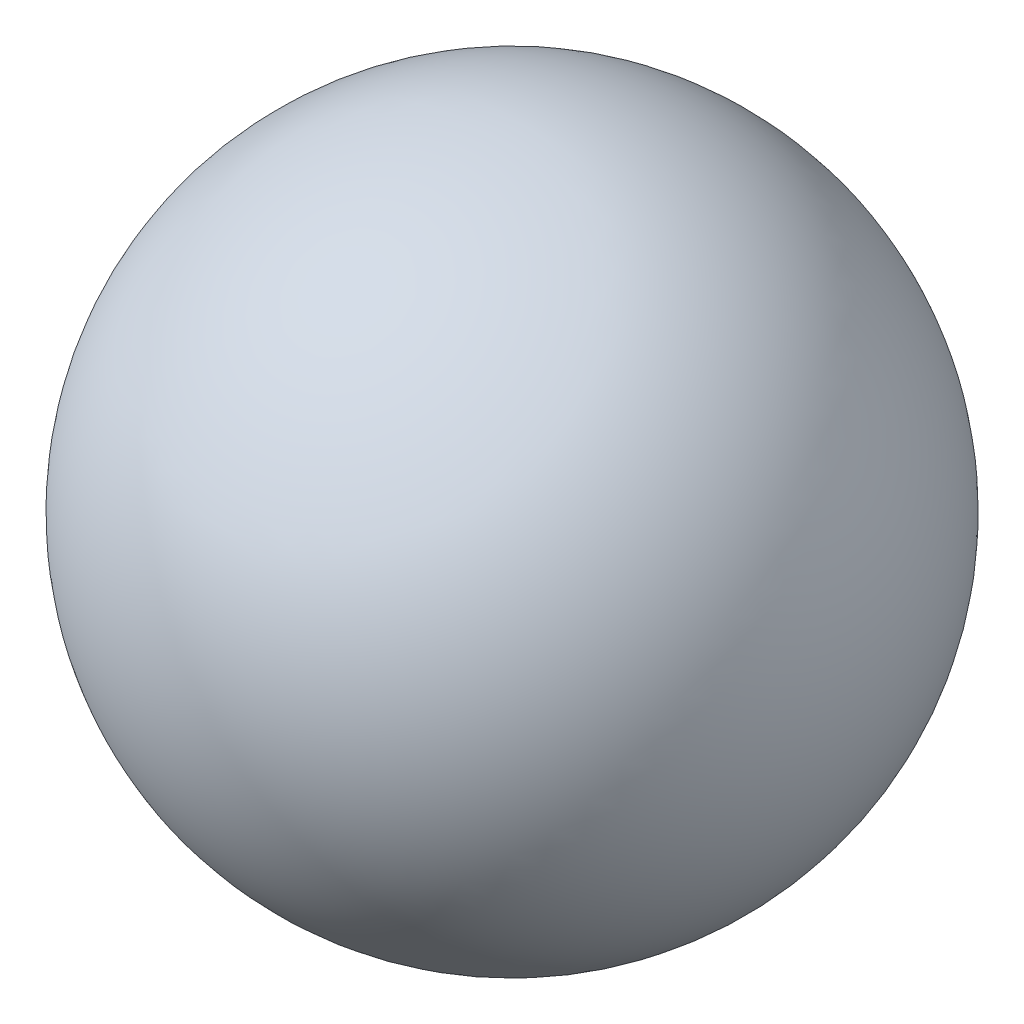
ISO-10303-21;
HEADER;
FILE_DESCRIPTION(('STEP AP214'),'2;1');
FILE_NAME('part.step','',(''),(''),'','','');
FILE_SCHEMA(('AUTOMOTIVE_DESIGN { 1 0 10303 214 1 1 1 1 }'));
ENDSEC;
DATA;
#1=APPLICATION_CONTEXT('core data for automotive mechanical design processes');
#2=APPLICATION_PROTOCOL_DEFINITION('international standard','automotive_design',2000,#1);
#3=PRODUCT_CONTEXT('',#1,'mechanical');
#4=PRODUCT('Part','Part','',(#3));
#5=PRODUCT_RELATED_PRODUCT_CATEGORY('part','',(#4));
#6=PRODUCT_DEFINITION_FORMATION('','',#4);
#7=PRODUCT_DEFINITION_CONTEXT('part definition',#1,'design');
#8=PRODUCT_DEFINITION('design','',#6,#7);
#9=PRODUCT_DEFINITION_SHAPE('','',#8);
#10=(LENGTH_UNIT() NAMED_UNIT(*) SI_UNIT(.MILLI.,.METRE.));
#11=(NAMED_UNIT(*) PLANE_ANGLE_UNIT() SI_UNIT($,.RADIAN.));
#12=(NAMED_UNIT(*) SI_UNIT($,.STERADIAN.) SOLID_ANGLE_UNIT());
#13=UNCERTAINTY_MEASURE_WITH_UNIT(LENGTH_MEASURE(1.E-05),#10,'distance_accuracy_value','');
#14=(GEOMETRIC_REPRESENTATION_CONTEXT(3) GLOBAL_UNCERTAINTY_ASSIGNED_CONTEXT((#13)) GLOBAL_UNIT_ASSIGNED_CONTEXT((#10,
#11,#12)) REPRESENTATION_CONTEXT('',''));
#15=CARTESIAN_POINT('',(0.,0.,0.));
#16=DIRECTION('',(0.,0.,1.));
#17=DIRECTION('',(1.,0.,0.));
#18=AXIS2_PLACEMENT_3D('',#15,#16,#17);
#19=CARTESIAN_POINT('',(0.,0.,0.));
#20=DIRECTION('',(0.,0.,1.));
#21=DIRECTION('',(-1.,0.,0.));
#22=AXIS2_PLACEMENT_3D('',#19,#20,#21);
#23=SPHERICAL_SURFACE('',#22,32.);
#24=CARTESIAN_POINT('',(0.,0.,32.));
#25=VERTEX_POINT('',#24);
#26=VERTEX_LOOP('',#25);
#27=FACE_BOUND('',#26,.T.);
#28=ADVANCED_FACE('F29',(#27),#23,.T.);
#29=CLOSED_SHELL('',(#28));
#30=MANIFOLD_SOLID_BREP('B2',#29);
#31=ADVANCED_BREP_SHAPE_REPRESENTATION('',(#18,#30),#14);
#32=SHAPE_DEFINITION_REPRESENTATION(#9,#31);
ENDSEC;
END-ISO-10303-21;
